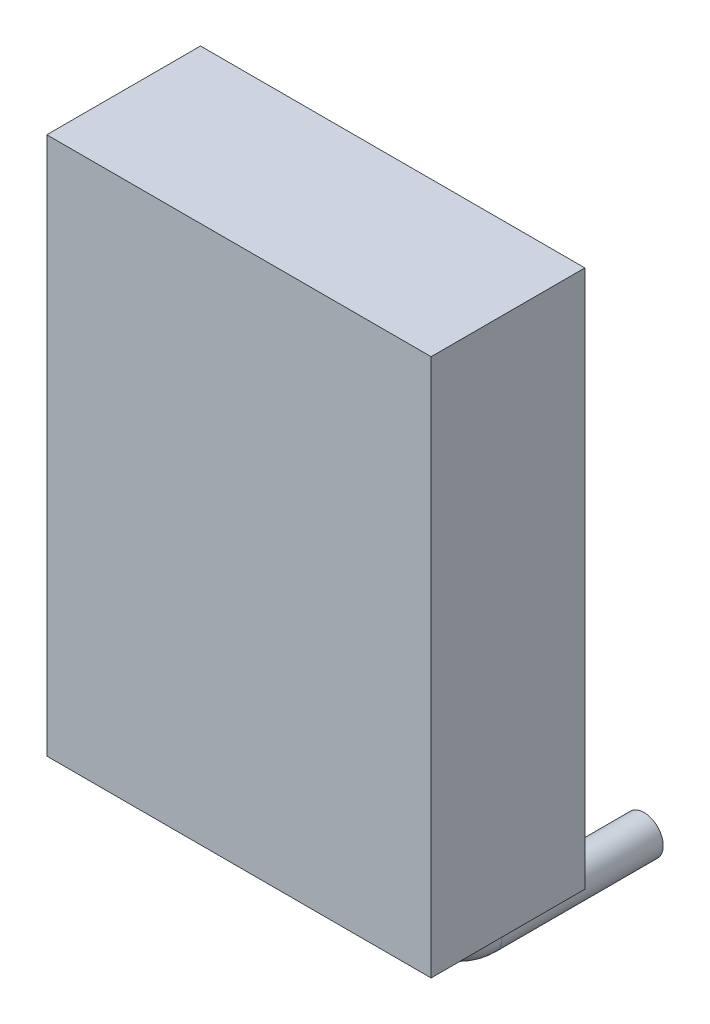
ISO-10303-21;
HEADER;
FILE_DESCRIPTION(('STEP AP214'),'2;1');
FILE_NAME('part.step','',(''),(''),'','','');
FILE_SCHEMA(('AUTOMOTIVE_DESIGN { 1 0 10303 214 1 1 1 1 }'));
ENDSEC;
DATA;
#1=APPLICATION_CONTEXT('core data for automotive mechanical design processes');
#2=APPLICATION_PROTOCOL_DEFINITION('international standard','automotive_design',2000,#1);
#3=PRODUCT_CONTEXT('',#1,'mechanical');
#4=PRODUCT('Part','Part','',(#3));
#5=PRODUCT_RELATED_PRODUCT_CATEGORY('part','',(#4));
#6=PRODUCT_DEFINITION_FORMATION('','',#4);
#7=PRODUCT_DEFINITION_CONTEXT('part definition',#1,'design');
#8=PRODUCT_DEFINITION('design','',#6,#7);
#9=PRODUCT_DEFINITION_SHAPE('','',#8);
#10=(LENGTH_UNIT() NAMED_UNIT(*) SI_UNIT(.MILLI.,.METRE.));
#11=(NAMED_UNIT(*) PLANE_ANGLE_UNIT() SI_UNIT($,.RADIAN.));
#12=(NAMED_UNIT(*) SI_UNIT($,.STERADIAN.) SOLID_ANGLE_UNIT());
#13=UNCERTAINTY_MEASURE_WITH_UNIT(LENGTH_MEASURE(1.E-05),#10,'distance_accuracy_value','');
#14=(GEOMETRIC_REPRESENTATION_CONTEXT(3) GLOBAL_UNCERTAINTY_ASSIGNED_CONTEXT((#13)) GLOBAL_UNIT_ASSIGNED_CONTEXT((#10,
#11,#12)) REPRESENTATION_CONTEXT('',''));
#15=CARTESIAN_POINT('',(0.,0.,0.));
#16=DIRECTION('',(0.,0.,1.));
#17=DIRECTION('',(1.,0.,0.));
#18=AXIS2_PLACEMENT_3D('',#15,#16,#17);
#19=CARTESIAN_POINT('',(1.27,-4.5,-2.));
#20=DIRECTION('',(0.,0.,1.));
#21=DIRECTION('',(-1.,0.,0.));
#22=AXIS2_PLACEMENT_3D('',#19,#20,#21);
#23=CYLINDRICAL_SURFACE('',#22,0.25);
#24=CARTESIAN_POINT('',(1.27,-4.5,-2.));
#25=DIRECTION('',(0.,0.,-1.));
#26=DIRECTION('',(-1.,0.,0.));
#27=AXIS2_PLACEMENT_3D('',#24,#25,#26);
#28=CIRCLE('',#27,0.25);
#29=CARTESIAN_POINT('',(1.02,-4.5,-2.));
#30=VERTEX_POINT('',#29);
#31=EDGE_CURVE('E12',#30,#30,#28,.T.);
#32=ORIENTED_EDGE('',*,*,#31,.F.);
#33=EDGE_LOOP('',(#32));
#34=FACE_BOUND('',#33,.T.);
#35=CARTESIAN_POINT('',(1.27317554843662,-4.74997983097067,0.1));
#36=CARTESIAN_POINT('',(1.28007392948115,-4.74989219932833,0.1));
#37=CARTESIAN_POINT('',(1.29373379993823,-4.74915852357953,0.1));
#38=CARTESIAN_POINT('',(1.31374920802712,-4.74644813506218,0.1));
#39=CARTESIAN_POINT('',(1.33322649581861,-4.74219323414889,0.1));
#40=CARTESIAN_POINT('',(1.44647916457883,-4.70778892928276,0.1));
#41=CARTESIAN_POINT('',(1.5213819372482,-4.60719854827599,0.1));
#42=CARTESIAN_POINT('',(1.51822719812377,-4.35885683067263,0.1));
#43=CARTESIAN_POINT('',(1.40479207245414,-4.24826753618242,0.1));
#44=CARTESIAN_POINT('',(1.12885683067263,-4.25177280187623,0.1));
#45=CARTESIAN_POINT('',(1.01826753618242,-4.36520792754586,0.1));
#46=CARTESIAN_POINT('',(1.02142227530685,-4.61354964514922,0.1));
#47=CARTESIAN_POINT('',(1.09885610834617,-4.71220486095399,0.1));
#48=CARTESIAN_POINT('',(1.21294618121795,-4.74372118127768,0.1));
#49=CARTESIAN_POINT('',(1.23252526828617,-4.74747994052368,0.1));
#50=CARTESIAN_POINT('',(1.25260306777911,-4.74968101626102,0.1));
#51=CARTESIAN_POINT('',(1.26627716739208,-4.75006746261302,0.1));
#52=CARTESIAN_POINT('',(1.27317554843662,-4.74997983097067,0.1));
#53=B_SPLINE_CURVE_WITH_KNOTS('',3,(#35,#36,#37,#38,#39,#40,#41,#42,#43,#44,#45,#46,#47,#48,#49,
#50,#51,#52),.UNSPECIFIED.,.T.,.F.,(4,1,1,1,1,2,2,2,1,1,1,1,4),(0.,0.0125,0.0249999999999999,
0.0375000000000001,0.05,0.25,0.5,0.75,0.95,0.9625,0.975,0.9875,1.),.UNSPECIFIED.);
#54=CARTESIAN_POINT('',(1.27317554843662,-4.74997983097067,0.1));
#55=VERTEX_POINT('',#54);
#56=EDGE_CURVE('E96',#55,#55,#53,.F.);
#57=ORIENTED_EDGE('',*,*,#56,.T.);
#58=EDGE_LOOP('',(#57));
#59=FACE_BOUND('',#58,.T.);
#60=ADVANCED_FACE('F86',(#34,#59),#23,.T.);
#61=CARTESIAN_POINT('',(1.27,-4.5,-2.));
#62=DIRECTION('',(0.,0.,1.));
#63=DIRECTION('',(-1.,0.,0.));
#64=AXIS2_PLACEMENT_3D('',#61,#62,#63);
#65=PLANE('',#64);
#66=ORIENTED_EDGE('',*,*,#31,.T.);
#67=EDGE_LOOP('',(#66));
#68=FACE_BOUND('',#67,.T.);
#69=ADVANCED_FACE('F130',(#68),#65,.F.);
#70=CARTESIAN_POINT('',(1.29931353077884,-3.6,1.24827548592899));
#71=CARTESIAN_POINT('',(1.29931353077884,-4.14177418392883,1.24827548592899));
#72=CARTESIAN_POINT('',(1.27317554843662,-4.74997983097067,0.641774183928828));
#73=CARTESIAN_POINT('',(1.27317554843662,-4.74997983097067,0.1));
#74=CARTESIAN_POINT('',(1.30616487914285,-3.6,1.24746655704746));
#75=CARTESIAN_POINT('',(1.30616487914285,-4.14156391044794,1.24746655704746));
#76=CARTESIAN_POINT('',(1.28007392948115,-4.74989219932833,0.641563910447944));
#77=CARTESIAN_POINT('',(1.28007392948115,-4.74989219932833,0.1));
#78=CARTESIAN_POINT('',(1.31967300886197,-3.6,1.24530767481356));
#79=CARTESIAN_POINT('',(1.31967300886197,-4.14087979934641,1.24530767481356));
#80=CARTESIAN_POINT('',(1.29373379993823,-4.74915852357953,0.640879799346404));
#81=CARTESIAN_POINT('',(1.29373379993823,-4.74915852357953,0.1));
#82=CARTESIAN_POINT('',(1.33929496835794,-3.6,1.24051794909923));
#83=CARTESIAN_POINT('',(1.33929496835794,-4.13911337745416,1.24051794909923));
#84=CARTESIAN_POINT('',(1.31374920802713,-4.74644813506218,0.63911337745416));
#85=CARTESIAN_POINT('',(1.31374920802712,-4.74644813506218,0.1));
#86=CARTESIAN_POINT('',(1.3582201587152,-3.6,1.23424849207042));
#87=CARTESIAN_POINT('',(1.3582201587152,-4.13662593207678,1.23424849207042));
#88=CARTESIAN_POINT('',(1.33322649581861,-4.74219323414889,0.636625932076781));
#89=CARTESIAN_POINT('',(1.33322649581861,-4.74219323414889,0.1));
#90=CARTESIAN_POINT('',(1.4672514816903,-3.6,1.18818338830486));
#91=CARTESIAN_POINT('',(1.4672514816903,-4.11777456215012,1.18818338830486));
#92=CARTESIAN_POINT('',(1.44647916457883,-4.70778892928276,0.617774562150112));
#93=CARTESIAN_POINT('',(1.44647916457883,-4.70778892928276,0.1));
#94=CARTESIAN_POINT('',(1.53121834803354,-3.6,1.08030804304529));
#95=CARTESIAN_POINT('',(1.53121834803354,-4.06403830058385,1.08030804304529));
#96=CARTESIAN_POINT('',(1.5213819372482,-4.60719854827599,0.564038300583844));
#97=CARTESIAN_POINT('',(1.5213819372482,-4.60719854827599,0.1));
#98=CARTESIAN_POINT('',(1.50209690829831,-3.6,0.833659501940993));
#99=CARTESIAN_POINT('',(1.50209690829831,-3.95741970252921,0.833659501940993));
#100=CARTESIAN_POINT('',(1.51822719812377,-4.35885683067263,0.457419702529208));
#101=CARTESIAN_POINT('',(1.51822719812377,-4.35885683067263,0.1));
#102=CARTESIAN_POINT('',(1.37771343650132,-3.6,0.73554593644032));
#103=CARTESIAN_POINT('',(1.37771343650132,-3.90317036902895,0.73554593644032));
#104=CARTESIAN_POINT('',(1.40479207245414,-4.24826753618242,0.403170369028953));
#105=CARTESIAN_POINT('',(1.40479207245414,-4.24826753618242,0.1));
#106=CARTESIAN_POINT('',(1.10365950194099,-3.6,0.767903091701694));
#107=CARTESIAN_POINT('',(1.10365950194099,-3.91072584243315,0.767903091701694));
#108=CARTESIAN_POINT('',(1.12885683067263,-4.25177280187623,0.41072584243315));
#109=CARTESIAN_POINT('',(1.12885683067263,-4.25177280187623,0.1));
#110=CARTESIAN_POINT('',(1.00554593644032,-3.6,0.892286563498682));
#111=CARTESIAN_POINT('',(1.00554593644032,-3.9725306493376,0.892286563498681));
#112=CARTESIAN_POINT('',(1.01826753618242,-4.36520792754586,0.472530649337603));
#113=CARTESIAN_POINT('',(1.01826753618242,-4.36520792754586,0.1));
#114=CARTESIAN_POINT('',(1.03466737617556,-3.6,1.13893510460297));
#115=CARTESIAN_POINT('',(1.03466737617556,-4.07951450929105,1.13893510460297));
#116=CARTESIAN_POINT('',(1.02142227530685,-4.61354964514922,0.579514509291046));
#117=CARTESIAN_POINT('',(1.02142227530685,-4.61354964514922,0.1));
#118=CARTESIAN_POINT('',(1.12199849519472,-3.6,1.22894691358106));
#119=CARTESIAN_POINT('',(1.12199849519472,-4.12842352155645,1.22894691358106));
#120=CARTESIAN_POINT('',(1.09885610834617,-4.71220486095399,0.628423521556445));
#121=CARTESIAN_POINT('',(1.09885610834617,-4.71220486095399,0.1));
#122=CARTESIAN_POINT('',(1.23875990690523,-3.6,1.24835299278332));
#123=CARTESIAN_POINT('',(1.23875990690523,-4.14031244153804,1.24835299278332));
#124=CARTESIAN_POINT('',(1.21294618121795,-4.74372118127768,0.640312441538041));
#125=CARTESIAN_POINT('',(1.21294618121795,-4.74372118127768,0.1));
#126=CARTESIAN_POINT('',(1.25862480776959,-3.6,1.2500425593381));
#127=CARTESIAN_POINT('',(1.25862480776959,-4.14160237564376,1.2500425593381));
#128=CARTESIAN_POINT('',(1.23252526828617,-4.74747994052368,0.641602375643756));
#129=CARTESIAN_POINT('',(1.23252526828617,-4.74747994052368,0.1));
#130=CARTESIAN_POINT('',(1.27882270316424,-3.6,1.25013081185794));
#131=CARTESIAN_POINT('',(1.27882270316424,-4.14214144023171,1.25013081185794));
#132=CARTESIAN_POINT('',(1.25260306777911,-4.74968101626102,0.642141440231706));
#133=CARTESIAN_POINT('',(1.25260306777911,-4.74968101626102,0.1));
#134=CARTESIAN_POINT('',(1.29246218241484,-3.6,1.24908441481053));
#135=CARTESIAN_POINT('',(1.29246218241484,-4.14198445740971,1.24908441481053));
#136=CARTESIAN_POINT('',(1.26627716739208,-4.75006746261302,0.641984457409712));
#137=CARTESIAN_POINT('',(1.26627716739208,-4.75006746261302,0.1));
#138=CARTESIAN_POINT('',(1.29931353077884,-3.6,1.24827548592899));
#139=CARTESIAN_POINT('',(1.29931353077884,-4.14177418392883,1.24827548592899));
#140=CARTESIAN_POINT('',(1.27317554843662,-4.74997983097067,0.641774183928828));
#141=CARTESIAN_POINT('',(1.27317554843662,-4.74997983097067,0.1));
#142=B_SPLINE_SURFACE_WITH_KNOTS('',3,3,((#70,#71,#72,#73),(#74,#75,#76,#77),(#78,#79,#80,#81),
(#82,#83,#84,#85),(#86,#87,#88,#89),(#90,#91,#92,#93),(#94,#95,#96,#97),(#98,#99,#100,#101),
(#102,#103,#104,#105),(#106,#107,#108,#109),(#110,#111,#112,#113),(#114,#115,#116,#117),(#118,
#119,#120,#121),(#122,#123,#124,#125),(#126,#127,#128,#129),(#130,#131,#132,#133),(#134,#135,
#136,#137),(#138,#139,#140,#141)),.UNSPECIFIED.,.T.,.F.,.F.,(4,1,1,1,1,2,2,2,1,1,1,1,4),(4,4),
(0.,0.0125,0.0249999999999999,0.0375000000000001,0.05,0.25,0.5,0.75,0.95,0.9625,0.975,0.9875,
1.),(0.,1.),.UNSPECIFIED.);
#143=CARTESIAN_POINT('',(1.29931353077884,-3.6,1.24827548592899));
#144=CARTESIAN_POINT('',(1.29246218241484,-3.6,1.24908441481053));
#145=CARTESIAN_POINT('',(1.27882270316424,-3.6,1.25013081185794));
#146=CARTESIAN_POINT('',(1.25862480776959,-3.6,1.2500425593381));
#147=CARTESIAN_POINT('',(1.23875990690523,-3.6,1.24835299278332));
#148=CARTESIAN_POINT('',(1.12199849519472,-3.6,1.22894691358106));
#149=CARTESIAN_POINT('',(1.03466737617556,-3.6,1.13893510460297));
#150=CARTESIAN_POINT('',(1.00554593644032,-3.6,0.892286563498682));
#151=CARTESIAN_POINT('',(1.10365950194099,-3.6,0.767903091701694));
#152=CARTESIAN_POINT('',(1.37771343650132,-3.6,0.73554593644032));
#153=CARTESIAN_POINT('',(1.50209690829831,-3.6,0.833659501940993));
#154=CARTESIAN_POINT('',(1.53121834803354,-3.6,1.08030804304529));
#155=CARTESIAN_POINT('',(1.4672514816903,-3.6,1.18818338830486));
#156=CARTESIAN_POINT('',(1.3582201587152,-3.6,1.23424849207042));
#157=CARTESIAN_POINT('',(1.33929496835794,-3.6,1.24051794909923));
#158=CARTESIAN_POINT('',(1.31967300886197,-3.6,1.24530767481356));
#159=CARTESIAN_POINT('',(1.30616487914285,-3.6,1.24746655704746));
#160=CARTESIAN_POINT('',(1.29931353077884,-3.6,1.24827548592899));
#161=B_SPLINE_CURVE_WITH_KNOTS('',3,(#143,#144,#145,#146,#147,#148,#149,#150,#151,#152,#153,
#154,#155,#156,#157,#158,#159,#160),.UNSPECIFIED.,.T.,.F.,(4,1,1,1,1,2,2,2,1,1,1,1,4),(0.,
0.0125,0.025,0.0375,0.0499999999999999,0.25,0.5,0.75,0.95,0.9625,0.975,0.9875,1.),.UNSPECIFIED.);
#162=CARTESIAN_POINT('',(1.29931353077884,-3.6,1.24827548592899));
#163=VERTEX_POINT('',#162);
#164=EDGE_CURVE('E103',#163,#163,#161,.F.);
#165=ORIENTED_EDGE('',*,*,#164,.F.);
#166=EDGE_LOOP('',(#165));
#167=FACE_BOUND('',#166,.T.);
#168=ORIENTED_EDGE('',*,*,#56,.F.);
#169=EDGE_LOOP('',(#168));
#170=FACE_BOUND('',#169,.T.);
#171=ADVANCED_FACE('F112',(#167,#170),#142,.F.);
#172=CARTESIAN_POINT('',(1.27,-3.6,1.));
#173=DIRECTION('',(0.,1.,0.));
#174=DIRECTION('',(0.,0.,1.));
#175=AXIS2_PLACEMENT_3D('',#172,#173,#174);
#176=CYLINDRICAL_SURFACE('',#175,0.25);
#177=ORIENTED_EDGE('',*,*,#164,.T.);
#178=EDGE_LOOP('',(#177));
#179=FACE_BOUND('',#178,.T.);
#180=CARTESIAN_POINT('',(1.27,-3.5,1.));
#181=DIRECTION('',(0.,1.,0.));
#182=DIRECTION('',(0.,0.,-1.));
#183=AXIS2_PLACEMENT_3D('',#180,#181,#182);
#184=CIRCLE('',#183,0.25);
#185=CARTESIAN_POINT('',(1.27,-3.5,0.75));
#186=VERTEX_POINT('',#185);
#187=EDGE_CURVE('E185',#186,#186,#184,.T.);
#188=ORIENTED_EDGE('',*,*,#187,.F.);
#189=EDGE_LOOP('',(#188));
#190=FACE_BOUND('',#189,.T.);
#191=ADVANCED_FACE('F129',(#179,#190),#176,.T.);
#192=CARTESIAN_POINT('',(1.27,-3.5,1.));
#193=DIRECTION('',(0.,-1.,0.));
#194=DIRECTION('',(0.,0.,-1.));
#195=AXIS2_PLACEMENT_3D('',#192,#193,#194);
#196=PLANE('',#195);
#197=ORIENTED_EDGE('',*,*,#187,.T.);
#198=EDGE_LOOP('',(#197));
#199=FACE_BOUND('',#198,.T.);
#200=ADVANCED_FACE('F162',(#199),#196,.F.);
#201=CLOSED_SHELL('',(#60,#69,#171,#191,#200));
#202=MANIFOLD_SOLID_BREP('B2',#201);
#203=CARTESIAN_POINT('',(-1.27,-4.5,-2.));
#204=DIRECTION('',(0.,0.,1.));
#205=DIRECTION('',(1.,0.,0.));
#206=AXIS2_PLACEMENT_3D('',#203,#204,#205);
#207=CYLINDRICAL_SURFACE('',#206,0.25);
#208=CARTESIAN_POINT('',(-1.27,-4.5,-2.));
#209=DIRECTION('',(0.,0.,1.));
#210=DIRECTION('',(1.,0.,0.));
#211=AXIS2_PLACEMENT_3D('',#208,#209,#210);
#212=CIRCLE('',#211,0.25);
#213=CARTESIAN_POINT('',(-1.02,-4.5,-2.));
#214=VERTEX_POINT('',#213);
#215=EDGE_CURVE('E85',#214,#214,#212,.T.);
#216=ORIENTED_EDGE('',*,*,#215,.T.);
#217=EDGE_LOOP('',(#216));
#218=FACE_BOUND('',#217,.T.);
#219=CARTESIAN_POINT('',(-1.27317554843662,-4.74997983097067,0.1));
#220=CARTESIAN_POINT('',(-1.26627716739208,-4.75006746261302,0.1));
#221=CARTESIAN_POINT('',(-1.25260306777911,-4.74968101626102,0.1));
#222=CARTESIAN_POINT('',(-1.23252526828617,-4.74747994052368,0.1));
#223=CARTESIAN_POINT('',(-1.21294618121795,-4.74372118127768,0.1));
#224=CARTESIAN_POINT('',(-1.09885610834617,-4.71220486095399,0.1));
#225=CARTESIAN_POINT('',(-1.02142227530685,-4.61354964514922,0.1));
#226=CARTESIAN_POINT('',(-1.01826753618242,-4.36520792754586,0.1));
#227=CARTESIAN_POINT('',(-1.12885683067263,-4.25177280187623,0.1));
#228=CARTESIAN_POINT('',(-1.40479207245414,-4.24826753618242,0.1));
#229=CARTESIAN_POINT('',(-1.51822719812377,-4.35885683067263,0.1));
#230=CARTESIAN_POINT('',(-1.5213819372482,-4.60719854827599,0.1));
#231=CARTESIAN_POINT('',(-1.44647916457883,-4.70778892928276,0.1));
#232=CARTESIAN_POINT('',(-1.33322649581861,-4.74219323414889,0.1));
#233=CARTESIAN_POINT('',(-1.31374920802712,-4.74644813506218,0.1));
#234=CARTESIAN_POINT('',(-1.29373379993823,-4.74915852357953,0.1));
#235=CARTESIAN_POINT('',(-1.28007392948115,-4.74989219932833,0.1));
#236=CARTESIAN_POINT('',(-1.27317554843662,-4.74997983097067,0.1));
#237=B_SPLINE_CURVE_WITH_KNOTS('',3,(#219,#220,#221,#222,#223,#224,#225,#226,#227,#228,#229,
#230,#231,#232,#233,#234,#235,#236),.UNSPECIFIED.,.T.,.F.,(4,1,1,1,1,2,2,2,1,1,1,1,4),(0.,
0.0125,0.025,0.0375,0.0499999999999999,0.25,0.5,0.75,0.95,0.9625,0.975,0.9875,1.),.UNSPECIFIED.);
#238=CARTESIAN_POINT('',(-1.27317554843662,-4.74997983097067,0.1));
#239=VERTEX_POINT('',#238);
#240=EDGE_CURVE('E230',#239,#239,#237,.T.);
#241=ORIENTED_EDGE('',*,*,#240,.F.);
#242=EDGE_LOOP('',(#241));
#243=FACE_BOUND('',#242,.T.);
#244=ADVANCED_FACE('F220',(#218,#243),#207,.T.);
#245=CARTESIAN_POINT('',(-1.27,-4.5,-2.));
#246=DIRECTION('',(0.,0.,1.));
#247=DIRECTION('',(1.,0.,0.));
#248=AXIS2_PLACEMENT_3D('',#245,#246,#247);
#249=PLANE('',#248);
#250=ORIENTED_EDGE('',*,*,#215,.F.);
#251=EDGE_LOOP('',(#250));
#252=FACE_BOUND('',#251,.T.);
#253=ADVANCED_FACE('F264',(#252),#249,.F.);
#254=CARTESIAN_POINT('',(-1.29931353077884,-3.6,1.24827548592899));
#255=CARTESIAN_POINT('',(-1.29931353077884,-4.14177418392883,1.24827548592899));
#256=CARTESIAN_POINT('',(-1.27317554843662,-4.74997983097067,0.641774183928828));
#257=CARTESIAN_POINT('',(-1.27317554843662,-4.74997983097067,0.1));
#258=CARTESIAN_POINT('',(-1.30616487914285,-3.6,1.24746655704746));
#259=CARTESIAN_POINT('',(-1.30616487914285,-4.14156391044794,1.24746655704746));
#260=CARTESIAN_POINT('',(-1.28007392948115,-4.74989219932833,0.641563910447944));
#261=CARTESIAN_POINT('',(-1.28007392948115,-4.74989219932833,0.1));
#262=CARTESIAN_POINT('',(-1.31967300886197,-3.6,1.24530767481356));
#263=CARTESIAN_POINT('',(-1.31967300886197,-4.14087979934641,1.24530767481356));
#264=CARTESIAN_POINT('',(-1.29373379993823,-4.74915852357953,0.640879799346404));
#265=CARTESIAN_POINT('',(-1.29373379993823,-4.74915852357953,0.1));
#266=CARTESIAN_POINT('',(-1.33929496835794,-3.6,1.24051794909923));
#267=CARTESIAN_POINT('',(-1.33929496835794,-4.13911337745416,1.24051794909923));
#268=CARTESIAN_POINT('',(-1.31374920802713,-4.74644813506218,0.63911337745416));
#269=CARTESIAN_POINT('',(-1.31374920802712,-4.74644813506218,0.1));
#270=CARTESIAN_POINT('',(-1.3582201587152,-3.6,1.23424849207042));
#271=CARTESIAN_POINT('',(-1.3582201587152,-4.13662593207678,1.23424849207042));
#272=CARTESIAN_POINT('',(-1.33322649581861,-4.74219323414889,0.636625932076781));
#273=CARTESIAN_POINT('',(-1.33322649581861,-4.74219323414889,0.1));
#274=CARTESIAN_POINT('',(-1.4672514816903,-3.6,1.18818338830486));
#275=CARTESIAN_POINT('',(-1.4672514816903,-4.11777456215012,1.18818338830486));
#276=CARTESIAN_POINT('',(-1.44647916457883,-4.70778892928276,0.617774562150112));
#277=CARTESIAN_POINT('',(-1.44647916457883,-4.70778892928276,0.1));
#278=CARTESIAN_POINT('',(-1.53121834803354,-3.6,1.08030804304529));
#279=CARTESIAN_POINT('',(-1.53121834803354,-4.06403830058385,1.08030804304529));
#280=CARTESIAN_POINT('',(-1.5213819372482,-4.60719854827599,0.564038300583844));
#281=CARTESIAN_POINT('',(-1.5213819372482,-4.60719854827599,0.1));
#282=CARTESIAN_POINT('',(-1.50209690829831,-3.6,0.833659501940993));
#283=CARTESIAN_POINT('',(-1.50209690829831,-3.95741970252921,0.833659501940993));
#284=CARTESIAN_POINT('',(-1.51822719812377,-4.35885683067263,0.457419702529208));
#285=CARTESIAN_POINT('',(-1.51822719812377,-4.35885683067263,0.1));
#286=CARTESIAN_POINT('',(-1.37771343650132,-3.6,0.73554593644032));
#287=CARTESIAN_POINT('',(-1.37771343650132,-3.90317036902895,0.73554593644032));
#288=CARTESIAN_POINT('',(-1.40479207245414,-4.24826753618242,0.403170369028953));
#289=CARTESIAN_POINT('',(-1.40479207245414,-4.24826753618242,0.1));
#290=CARTESIAN_POINT('',(-1.10365950194099,-3.6,0.767903091701694));
#291=CARTESIAN_POINT('',(-1.10365950194099,-3.91072584243315,0.767903091701694));
#292=CARTESIAN_POINT('',(-1.12885683067263,-4.25177280187623,0.41072584243315));
#293=CARTESIAN_POINT('',(-1.12885683067263,-4.25177280187623,0.1));
#294=CARTESIAN_POINT('',(-1.00554593644032,-3.6,0.892286563498682));
#295=CARTESIAN_POINT('',(-1.00554593644032,-3.9725306493376,0.892286563498681));
#296=CARTESIAN_POINT('',(-1.01826753618242,-4.36520792754586,0.472530649337603));
#297=CARTESIAN_POINT('',(-1.01826753618242,-4.36520792754586,0.1));
#298=CARTESIAN_POINT('',(-1.03466737617556,-3.6,1.13893510460297));
#299=CARTESIAN_POINT('',(-1.03466737617556,-4.07951450929105,1.13893510460297));
#300=CARTESIAN_POINT('',(-1.02142227530685,-4.61354964514922,0.579514509291046));
#301=CARTESIAN_POINT('',(-1.02142227530685,-4.61354964514922,0.1));
#302=CARTESIAN_POINT('',(-1.12199849519472,-3.6,1.22894691358106));
#303=CARTESIAN_POINT('',(-1.12199849519472,-4.12842352155645,1.22894691358106));
#304=CARTESIAN_POINT('',(-1.09885610834617,-4.71220486095399,0.628423521556445));
#305=CARTESIAN_POINT('',(-1.09885610834617,-4.71220486095399,0.1));
#306=CARTESIAN_POINT('',(-1.23875990690523,-3.6,1.24835299278332));
#307=CARTESIAN_POINT('',(-1.23875990690523,-4.14031244153804,1.24835299278332));
#308=CARTESIAN_POINT('',(-1.21294618121795,-4.74372118127768,0.640312441538041));
#309=CARTESIAN_POINT('',(-1.21294618121795,-4.74372118127768,0.1));
#310=CARTESIAN_POINT('',(-1.25862480776959,-3.6,1.2500425593381));
#311=CARTESIAN_POINT('',(-1.25862480776959,-4.14160237564376,1.2500425593381));
#312=CARTESIAN_POINT('',(-1.23252526828617,-4.74747994052368,0.641602375643756));
#313=CARTESIAN_POINT('',(-1.23252526828617,-4.74747994052368,0.1));
#314=CARTESIAN_POINT('',(-1.27882270316424,-3.6,1.25013081185794));
#315=CARTESIAN_POINT('',(-1.27882270316424,-4.14214144023171,1.25013081185794));
#316=CARTESIAN_POINT('',(-1.25260306777911,-4.74968101626102,0.642141440231706));
#317=CARTESIAN_POINT('',(-1.25260306777911,-4.74968101626102,0.1));
#318=CARTESIAN_POINT('',(-1.29246218241484,-3.6,1.24908441481053));
#319=CARTESIAN_POINT('',(-1.29246218241484,-4.14198445740971,1.24908441481053));
#320=CARTESIAN_POINT('',(-1.26627716739208,-4.75006746261302,0.641984457409712));
#321=CARTESIAN_POINT('',(-1.26627716739208,-4.75006746261302,0.1));
#322=CARTESIAN_POINT('',(-1.29931353077884,-3.6,1.24827548592899));
#323=CARTESIAN_POINT('',(-1.29931353077884,-4.14177418392883,1.24827548592899));
#324=CARTESIAN_POINT('',(-1.27317554843662,-4.74997983097067,0.641774183928828));
#325=CARTESIAN_POINT('',(-1.27317554843662,-4.74997983097067,0.1));
#326=B_SPLINE_SURFACE_WITH_KNOTS('',3,3,((#254,#255,#256,#257),(#258,#259,#260,#261),(#262,#263,
#264,#265),(#266,#267,#268,#269),(#270,#271,#272,#273),(#274,#275,#276,#277),(#278,#279,#280,
#281),(#282,#283,#284,#285),(#286,#287,#288,#289),(#290,#291,#292,#293),(#294,#295,#296,#297),
(#298,#299,#300,#301),(#302,#303,#304,#305),(#306,#307,#308,#309),(#310,#311,#312,#313),(#314,
#315,#316,#317),(#318,#319,#320,#321),(#322,#323,#324,#325)),.UNSPECIFIED.,.T.,.F.,.F.,(4,1,1,1,
1,2,2,2,1,1,1,1,4),(4,4),(0.,0.0125,0.0249999999999999,0.0375000000000001,0.05,0.25,0.5,0.75,
0.95,0.9625,0.975,0.9875,1.),(0.,1.),.UNSPECIFIED.);
#327=CARTESIAN_POINT('',(-1.29931353077884,-3.6,1.24827548592899));
#328=CARTESIAN_POINT('',(-1.30616487914285,-3.6,1.24746655704746));
#329=CARTESIAN_POINT('',(-1.31967300886197,-3.6,1.24530767481356));
#330=CARTESIAN_POINT('',(-1.33929496835794,-3.6,1.24051794909923));
#331=CARTESIAN_POINT('',(-1.3582201587152,-3.6,1.23424849207042));
#332=CARTESIAN_POINT('',(-1.4672514816903,-3.6,1.18818338830486));
#333=CARTESIAN_POINT('',(-1.53121834803354,-3.6,1.08030804304529));
#334=CARTESIAN_POINT('',(-1.50209690829831,-3.6,0.833659501940993));
#335=CARTESIAN_POINT('',(-1.37771343650132,-3.6,0.73554593644032));
#336=CARTESIAN_POINT('',(-1.10365950194099,-3.6,0.767903091701694));
#337=CARTESIAN_POINT('',(-1.00554593644032,-3.6,0.892286563498682));
#338=CARTESIAN_POINT('',(-1.03466737617556,-3.6,1.13893510460297));
#339=CARTESIAN_POINT('',(-1.12199849519472,-3.6,1.22894691358106));
#340=CARTESIAN_POINT('',(-1.23875990690523,-3.6,1.24835299278332));
#341=CARTESIAN_POINT('',(-1.25862480776959,-3.6,1.2500425593381));
#342=CARTESIAN_POINT('',(-1.27882270316424,-3.6,1.25013081185794));
#343=CARTESIAN_POINT('',(-1.29246218241484,-3.6,1.24908441481053));
#344=CARTESIAN_POINT('',(-1.29931353077884,-3.6,1.24827548592899));
#345=B_SPLINE_CURVE_WITH_KNOTS('',3,(#327,#328,#329,#330,#331,#332,#333,#334,#335,#336,#337,
#338,#339,#340,#341,#342,#343,#344),.UNSPECIFIED.,.T.,.F.,(4,1,1,1,1,2,2,2,1,1,1,1,4),(0.,
0.0125,0.0249999999999999,0.0375000000000001,0.05,0.25,0.5,0.75,0.95,0.9625,0.975,0.9875,1.),.UNSPECIFIED.);
#346=CARTESIAN_POINT('',(-1.29931353077884,-3.6,1.24827548592899));
#347=VERTEX_POINT('',#346);
#348=EDGE_CURVE('E237',#347,#347,#345,.T.);
#349=ORIENTED_EDGE('',*,*,#348,.T.);
#350=EDGE_LOOP('',(#349));
#351=FACE_BOUND('',#350,.T.);
#352=ORIENTED_EDGE('',*,*,#240,.T.);
#353=EDGE_LOOP('',(#352));
#354=FACE_BOUND('',#353,.T.);
#355=ADVANCED_FACE('F246',(#351,#354),#326,.T.);
#356=CARTESIAN_POINT('',(-1.27,-3.6,1.));
#357=DIRECTION('',(0.,1.,0.));
#358=DIRECTION('',(0.,0.,1.));
#359=AXIS2_PLACEMENT_3D('',#356,#357,#358);
#360=CYLINDRICAL_SURFACE('',#359,0.25);
#361=ORIENTED_EDGE('',*,*,#348,.F.);
#362=EDGE_LOOP('',(#361));
#363=FACE_BOUND('',#362,.T.);
#364=CARTESIAN_POINT('',(-1.27,-3.5,1.));
#365=DIRECTION('',(0.,-1.,0.));
#366=DIRECTION('',(0.,0.,-1.));
#367=AXIS2_PLACEMENT_3D('',#364,#365,#366);
#368=CIRCLE('',#367,0.25);
#369=CARTESIAN_POINT('',(-1.27,-3.5,0.75));
#370=VERTEX_POINT('',#369);
#371=EDGE_CURVE('E319',#370,#370,#368,.T.);
#372=ORIENTED_EDGE('',*,*,#371,.T.);
#373=EDGE_LOOP('',(#372));
#374=FACE_BOUND('',#373,.T.);
#375=ADVANCED_FACE('F263',(#363,#374),#360,.T.);
#376=CARTESIAN_POINT('',(-1.27,-3.5,1.));
#377=DIRECTION('',(0.,-1.,0.));
#378=DIRECTION('',(0.,0.,-1.));
#379=AXIS2_PLACEMENT_3D('',#376,#377,#378);
#380=PLANE('',#379);
#381=ORIENTED_EDGE('',*,*,#371,.F.);
#382=EDGE_LOOP('',(#381));
#383=FACE_BOUND('',#382,.T.);
#384=ADVANCED_FACE('F296',(#383),#380,.F.);
#385=CLOSED_SHELL('',(#244,#253,#355,#375,#384));
#386=MANIFOLD_SOLID_BREP('B7',#385);
#387=CARTESIAN_POINT('',(2.5,-3.5,2.));
#388=DIRECTION('',(-1.,0.,0.));
#389=DIRECTION('',(0.,0.,1.));
#390=AXIS2_PLACEMENT_3D('',#387,#388,#389);
#391=PLANE('',#390);
#392=DIRECTION('',(0.,1.,0.));
#393=VECTOR('',#392,1.);
#394=CARTESIAN_POINT('',(2.5,-3.5,0.));
#395=LINE('',#394,#393);
#396=CARTESIAN_POINT('',(2.5,-3.5,0.));
#397=VERTEX_POINT('',#396);
#398=CARTESIAN_POINT('',(2.5,3.5,0.));
#399=VERTEX_POINT('',#398);
#400=EDGE_CURVE('E413',#397,#399,#395,.T.);
#401=ORIENTED_EDGE('',*,*,#400,.T.);
#402=DIRECTION('',(0.,0.,-1.));
#403=VECTOR('',#402,1.);
#404=CARTESIAN_POINT('',(2.5,3.5,2.));
#405=LINE('',#404,#403);
#406=CARTESIAN_POINT('',(2.5,3.5,2.));
#407=VERTEX_POINT('',#406);
#408=EDGE_CURVE('E218',#407,#399,#405,.T.);
#409=ORIENTED_EDGE('',*,*,#408,.F.);
#410=DIRECTION('',(0.,1.,0.));
#411=VECTOR('',#410,1.);
#412=CARTESIAN_POINT('',(2.5,-3.5,2.));
#413=LINE('',#412,#411);
#414=CARTESIAN_POINT('',(2.5,-3.5,2.));
#415=VERTEX_POINT('',#414);
#416=EDGE_CURVE('E397',#415,#407,#413,.T.);
#417=ORIENTED_EDGE('',*,*,#416,.F.);
#418=DIRECTION('',(0.,0.,-1.));
#419=VECTOR('',#418,1.);
#420=CARTESIAN_POINT('',(2.5,-3.5,2.));
#421=LINE('',#420,#419);
#422=EDGE_CURVE('E409',#415,#397,#421,.T.);
#423=ORIENTED_EDGE('',*,*,#422,.T.);
#424=EDGE_LOOP('',(#401,#409,#417,#423));
#425=FACE_BOUND('',#424,.T.);
#426=ADVANCED_FACE('F345',(#425),#391,.F.);
#427=CARTESIAN_POINT('',(-2.5,3.5,2.));
#428=DIRECTION('',(0.,-1.,0.));
#429=DIRECTION('',(0.,0.,-1.));
#430=AXIS2_PLACEMENT_3D('',#427,#428,#429);
#431=PLANE('',#430);
#432=DIRECTION('',(-1.,0.,0.));
#433=VECTOR('',#432,1.);
#434=CARTESIAN_POINT('',(-2.5,3.5,0.));
#435=LINE('',#434,#433);
#436=CARTESIAN_POINT('',(-2.5,3.5,0.));
#437=VERTEX_POINT('',#436);
#438=EDGE_CURVE('E402',#399,#437,#435,.T.);
#439=ORIENTED_EDGE('',*,*,#438,.T.);
#440=DIRECTION('',(0.,0.,-1.));
#441=VECTOR('',#440,1.);
#442=CARTESIAN_POINT('',(-2.5,3.5,2.));
#443=LINE('',#442,#441);
#444=CARTESIAN_POINT('',(-2.5,3.5,2.));
#445=VERTEX_POINT('',#444);
#446=EDGE_CURVE('E354',#445,#437,#443,.T.);
#447=ORIENTED_EDGE('',*,*,#446,.F.);
#448=DIRECTION('',(-1.,0.,0.));
#449=VECTOR('',#448,1.);
#450=CARTESIAN_POINT('',(-2.5,3.5,2.));
#451=LINE('',#450,#449);
#452=EDGE_CURVE('E392',#407,#445,#451,.T.);
#453=ORIENTED_EDGE('',*,*,#452,.F.);
#454=ORIENTED_EDGE('',*,*,#408,.T.);
#455=EDGE_LOOP('',(#439,#447,#453,#454));
#456=FACE_BOUND('',#455,.T.);
#457=ADVANCED_FACE('F401',(#456),#431,.F.);
#458=CARTESIAN_POINT('',(-2.5,-3.5,2.));
#459=DIRECTION('',(1.,0.,0.));
#460=DIRECTION('',(0.,0.,-1.));
#461=AXIS2_PLACEMENT_3D('',#458,#459,#460);
#462=PLANE('',#461);
#463=DIRECTION('',(0.,-1.,0.));
#464=VECTOR('',#463,1.);
#465=CARTESIAN_POINT('',(-2.5,-3.5,0.));
#466=LINE('',#465,#464);
#467=CARTESIAN_POINT('',(-2.5,-3.5,0.));
#468=VERTEX_POINT('',#467);
#469=EDGE_CURVE('E379',#437,#468,#466,.T.);
#470=ORIENTED_EDGE('',*,*,#469,.T.);
#471=DIRECTION('',(0.,0.,-1.));
#472=VECTOR('',#471,1.);
#473=CARTESIAN_POINT('',(-2.5,-3.5,2.));
#474=LINE('',#473,#472);
#475=CARTESIAN_POINT('',(-2.5,-3.5,2.));
#476=VERTEX_POINT('',#475);
#477=EDGE_CURVE('E404',#476,#468,#474,.T.);
#478=ORIENTED_EDGE('',*,*,#477,.F.);
#479=DIRECTION('',(0.,-1.,0.));
#480=VECTOR('',#479,1.);
#481=CARTESIAN_POINT('',(-2.5,-3.5,2.));
#482=LINE('',#481,#480);
#483=EDGE_CURVE('E395',#445,#476,#482,.T.);
#484=ORIENTED_EDGE('',*,*,#483,.F.);
#485=ORIENTED_EDGE('',*,*,#446,.T.);
#486=EDGE_LOOP('',(#470,#478,#484,#485));
#487=FACE_BOUND('',#486,.T.);
#488=ADVANCED_FACE('F405',(#487),#462,.F.);
#489=CARTESIAN_POINT('',(-2.5,-3.5,2.));
#490=DIRECTION('',(0.,1.,0.));
#491=DIRECTION('',(0.,0.,1.));
#492=AXIS2_PLACEMENT_3D('',#489,#490,#491);
#493=PLANE('',#492);
#494=DIRECTION('',(1.,0.,0.));
#495=VECTOR('',#494,1.);
#496=CARTESIAN_POINT('',(-2.5,-3.5,0.));
#497=LINE('',#496,#495);
#498=EDGE_CURVE('E385',#468,#397,#497,.T.);
#499=ORIENTED_EDGE('',*,*,#498,.T.);
#500=ORIENTED_EDGE('',*,*,#422,.F.);
#501=DIRECTION('',(1.,0.,0.));
#502=VECTOR('',#501,1.);
#503=CARTESIAN_POINT('',(-2.5,-3.5,2.));
#504=LINE('',#503,#502);
#505=EDGE_CURVE('E362',#476,#415,#504,.T.);
#506=ORIENTED_EDGE('',*,*,#505,.F.);
#507=ORIENTED_EDGE('',*,*,#477,.T.);
#508=EDGE_LOOP('',(#499,#500,#506,#507));
#509=FACE_BOUND('',#508,.T.);
#510=ADVANCED_FACE('F427',(#509),#493,.F.);
#511=CARTESIAN_POINT('',(0.,0.,2.));
#512=DIRECTION('',(0.,0.,-1.));
#513=DIRECTION('',(-1.,0.,0.));
#514=AXIS2_PLACEMENT_3D('',#511,#512,#513);
#515=PLANE('',#514);
#516=ORIENTED_EDGE('',*,*,#416,.T.);
#517=ORIENTED_EDGE('',*,*,#452,.T.);
#518=ORIENTED_EDGE('',*,*,#483,.T.);
#519=ORIENTED_EDGE('',*,*,#505,.T.);
#520=EDGE_LOOP('',(#516,#517,#518,#519));
#521=FACE_BOUND('',#520,.T.);
#522=ADVANCED_FACE('F393',(#521),#515,.F.);
#523=CARTESIAN_POINT('',(0.,0.,0.));
#524=DIRECTION('',(0.,0.,-1.));
#525=DIRECTION('',(-1.,0.,0.));
#526=AXIS2_PLACEMENT_3D('',#523,#524,#525);
#527=PLANE('',#526);
#528=ORIENTED_EDGE('',*,*,#400,.F.);
#529=ORIENTED_EDGE('',*,*,#498,.F.);
#530=ORIENTED_EDGE('',*,*,#469,.F.);
#531=ORIENTED_EDGE('',*,*,#438,.F.);
#532=EDGE_LOOP('',(#528,#529,#530,#531));
#533=FACE_BOUND('',#532,.T.);
#534=ADVANCED_FACE('F430',(#533),#527,.T.);
#535=CLOSED_SHELL('',(#426,#457,#488,#510,#522,#534));
#536=MANIFOLD_SOLID_BREP('B80',#535);
#537=ADVANCED_BREP_SHAPE_REPRESENTATION('',(#18,#202,#386,#536),#14);
#538=SHAPE_DEFINITION_REPRESENTATION(#9,#537);
ENDSEC;
END-ISO-10303-21;
